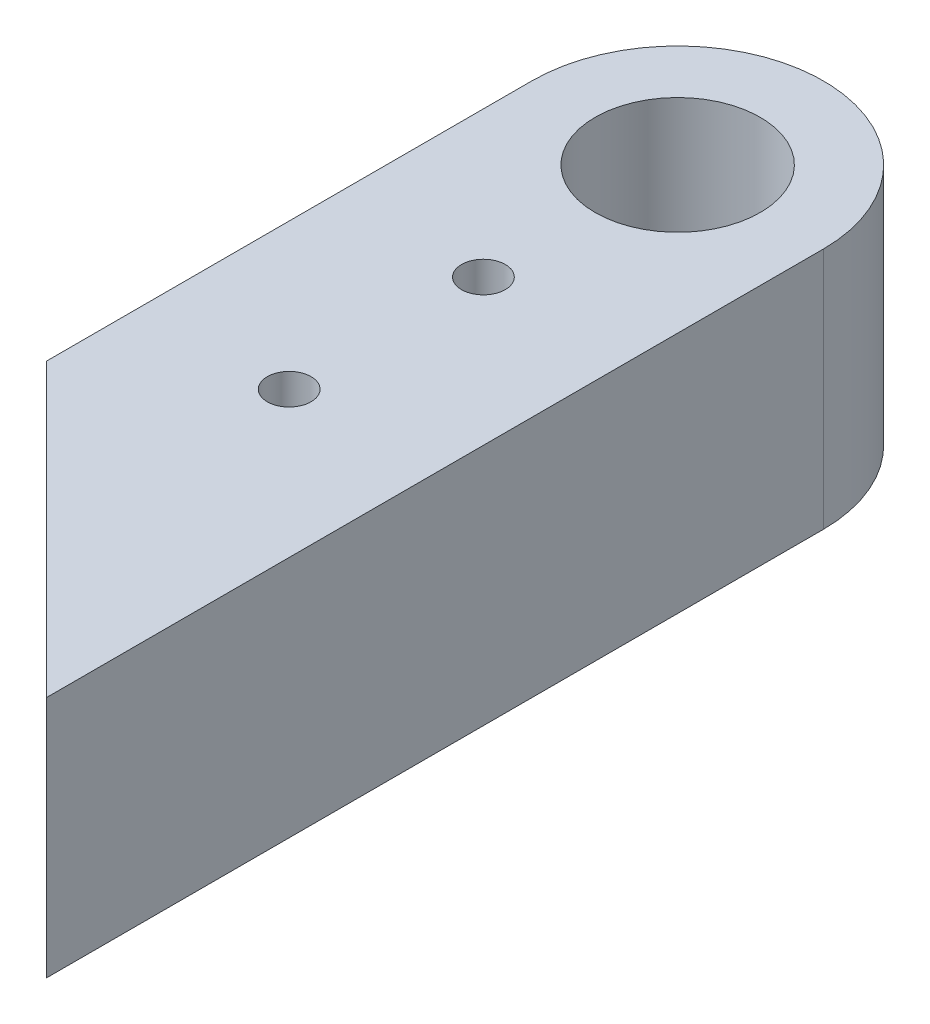
ISO-10303-21;
HEADER;
FILE_DESCRIPTION(('STEP AP214'),'2;1');
FILE_NAME('part.step','',(''),(''),'','','');
FILE_SCHEMA(('AUTOMOTIVE_DESIGN { 1 0 10303 214 1 1 1 1 }'));
ENDSEC;
DATA;
#1=APPLICATION_CONTEXT('core data for automotive mechanical design processes');
#2=APPLICATION_PROTOCOL_DEFINITION('international standard','automotive_design',2000,#1);
#3=PRODUCT_CONTEXT('',#1,'mechanical');
#4=PRODUCT('Part','Part','',(#3));
#5=PRODUCT_RELATED_PRODUCT_CATEGORY('part','',(#4));
#6=PRODUCT_DEFINITION_FORMATION('','',#4);
#7=PRODUCT_DEFINITION_CONTEXT('part definition',#1,'design');
#8=PRODUCT_DEFINITION('design','',#6,#7);
#9=PRODUCT_DEFINITION_SHAPE('','',#8);
#10=(LENGTH_UNIT() NAMED_UNIT(*) SI_UNIT(.MILLI.,.METRE.));
#11=(NAMED_UNIT(*) PLANE_ANGLE_UNIT() SI_UNIT($,.RADIAN.));
#12=(NAMED_UNIT(*) SI_UNIT($,.STERADIAN.) SOLID_ANGLE_UNIT());
#13=UNCERTAINTY_MEASURE_WITH_UNIT(LENGTH_MEASURE(1.E-05),#10,'distance_accuracy_value','');
#14=(GEOMETRIC_REPRESENTATION_CONTEXT(3) GLOBAL_UNCERTAINTY_ASSIGNED_CONTEXT((#13)) GLOBAL_UNIT_ASSIGNED_CONTEXT((#10,
#11,#12)) REPRESENTATION_CONTEXT('',''));
#15=CARTESIAN_POINT('',(0.,0.,0.));
#16=DIRECTION('',(0.,0.,1.));
#17=DIRECTION('',(1.,0.,0.));
#18=AXIS2_PLACEMENT_3D('',#15,#16,#17);
#19=CARTESIAN_POINT('',(0.,25.,0.));
#20=DIRECTION('',(0.,1.,0.));
#21=DIRECTION('',(0.,0.,1.));
#22=AXIS2_PLACEMENT_3D('',#19,#20,#21);
#23=PLANE('',#22);
#24=CARTESIAN_POINT('',(0.,25.,20.));
#25=DIRECTION('',(0.,1.,0.));
#26=DIRECTION('',(0.,0.,1.));
#27=AXIS2_PLACEMENT_3D('',#24,#25,#26);
#28=CIRCLE('',#27,2.25);
#29=CARTESIAN_POINT('',(0.,25.,22.25));
#30=VERTEX_POINT('',#29);
#31=EDGE_CURVE('E112',#30,#30,#28,.T.);
#32=ORIENTED_EDGE('',*,*,#31,.F.);
#33=EDGE_LOOP('',(#32));
#34=FACE_BOUND('',#33,.T.);
#35=CARTESIAN_POINT('',(0.,25.,0.));
#36=DIRECTION('',(0.,1.,0.));
#37=DIRECTION('',(0.,0.,1.));
#38=AXIS2_PLACEMENT_3D('',#35,#36,#37);
#39=CIRCLE('',#38,15.);
#40=CARTESIAN_POINT('',(15.,25.,0.));
#41=VERTEX_POINT('',#40);
#42=CARTESIAN_POINT('',(-15.,25.,0.));
#43=VERTEX_POINT('',#42);
#44=EDGE_CURVE('E83',#41,#43,#39,.T.);
#45=ORIENTED_EDGE('',*,*,#44,.T.);
#46=DIRECTION('',(0.,0.,1.));
#47=VECTOR('',#46,1.);
#48=CARTESIAN_POINT('',(-15.,25.,0.));
#49=LINE('',#48,#47);
#50=CARTESIAN_POINT('',(-15.,25.,50.));
#51=VERTEX_POINT('',#50);
#52=EDGE_CURVE('E77',#43,#51,#49,.T.);
#53=ORIENTED_EDGE('',*,*,#52,.T.);
#54=DIRECTION('',(0.707106781186556,0.,0.707106781186539));
#55=VECTOR('',#54,1.);
#56=CARTESIAN_POINT('',(-15.,25.,50.));
#57=LINE('',#56,#55);
#58=CARTESIAN_POINT('',(15.,25.,79.9999999999993));
#59=VERTEX_POINT('',#58);
#60=EDGE_CURVE('E80',#51,#59,#57,.T.);
#61=ORIENTED_EDGE('',*,*,#60,.T.);
#62=DIRECTION('',(0.,0.,-1.));
#63=VECTOR('',#62,1.);
#64=CARTESIAN_POINT('',(15.,25.,79.9999999999993));
#65=LINE('',#64,#63);
#66=EDGE_CURVE('E49',#59,#41,#65,.T.);
#67=ORIENTED_EDGE('',*,*,#66,.T.);
#68=EDGE_LOOP('',(#45,#53,#61,#67));
#69=FACE_BOUND('',#68,.T.);
#70=CARTESIAN_POINT('',(0.,25.,0.));
#71=DIRECTION('',(0.,1.,0.));
#72=DIRECTION('',(0.,0.,1.));
#73=AXIS2_PLACEMENT_3D('',#70,#71,#72);
#74=CIRCLE('',#73,8.5);
#75=CARTESIAN_POINT('',(0.,25.,8.5));
#76=VERTEX_POINT('',#75);
#77=EDGE_CURVE('E100',#76,#76,#74,.T.);
#78=ORIENTED_EDGE('',*,*,#77,.F.);
#79=EDGE_LOOP('',(#78));
#80=FACE_BOUND('',#79,.T.);
#81=CARTESIAN_POINT('',(0.,25.,40.));
#82=DIRECTION('',(0.,1.,0.));
#83=DIRECTION('',(0.,0.,1.));
#84=AXIS2_PLACEMENT_3D('',#81,#82,#83);
#85=CIRCLE('',#84,2.25);
#86=CARTESIAN_POINT('',(0.,25.,42.25));
#87=VERTEX_POINT('',#86);
#88=EDGE_CURVE('E118',#87,#87,#85,.T.);
#89=ORIENTED_EDGE('',*,*,#88,.F.);
#90=EDGE_LOOP('',(#89));
#91=FACE_BOUND('',#90,.T.);
#92=ADVANCED_FACE('F32',(#34,#69,#80,#91),#23,.T.);
#93=CARTESIAN_POINT('',(0.,0.,0.));
#94=DIRECTION('',(0.,1.,0.));
#95=DIRECTION('',(0.,0.,1.));
#96=AXIS2_PLACEMENT_3D('',#93,#94,#95);
#97=PLANE('',#96);
#98=CARTESIAN_POINT('',(0.,0.,0.));
#99=DIRECTION('',(0.,1.,0.));
#100=DIRECTION('',(0.,0.,1.));
#101=AXIS2_PLACEMENT_3D('',#98,#99,#100);
#102=CIRCLE('',#101,15.);
#103=CARTESIAN_POINT('',(15.,0.,0.));
#104=VERTEX_POINT('',#103);
#105=CARTESIAN_POINT('',(-15.,0.,0.));
#106=VERTEX_POINT('',#105);
#107=EDGE_CURVE('E97',#104,#106,#102,.T.);
#108=ORIENTED_EDGE('',*,*,#107,.F.);
#109=DIRECTION('',(0.,0.,-1.));
#110=VECTOR('',#109,1.);
#111=CARTESIAN_POINT('',(15.,0.,50.));
#112=LINE('',#111,#110);
#113=CARTESIAN_POINT('',(15.,0.,79.9999999999993));
#114=VERTEX_POINT('',#113);
#115=EDGE_CURVE('E66',#114,#104,#112,.T.);
#116=ORIENTED_EDGE('',*,*,#115,.F.);
#117=DIRECTION('',(0.707106781186556,0.,0.707106781186539));
#118=VECTOR('',#117,1.);
#119=CARTESIAN_POINT('',(-15.,0.,50.));
#120=LINE('',#119,#118);
#121=CARTESIAN_POINT('',(-15.,0.,50.));
#122=VERTEX_POINT('',#121);
#123=EDGE_CURVE('E102',#122,#114,#120,.T.);
#124=ORIENTED_EDGE('',*,*,#123,.F.);
#125=DIRECTION('',(0.,0.,1.));
#126=VECTOR('',#125,1.);
#127=CARTESIAN_POINT('',(-15.,0.,0.));
#128=LINE('',#127,#126);
#129=EDGE_CURVE('E88',#106,#122,#128,.T.);
#130=ORIENTED_EDGE('',*,*,#129,.F.);
#131=EDGE_LOOP('',(#108,#116,#124,#130));
#132=FACE_BOUND('',#131,.T.);
#133=CARTESIAN_POINT('',(0.,0.,0.));
#134=DIRECTION('',(0.,1.,0.));
#135=DIRECTION('',(0.,0.,1.));
#136=AXIS2_PLACEMENT_3D('',#133,#134,#135);
#137=CIRCLE('',#136,8.5);
#138=CARTESIAN_POINT('',(0.,0.,8.5));
#139=VERTEX_POINT('',#138);
#140=EDGE_CURVE('E109',#139,#139,#137,.T.);
#141=ORIENTED_EDGE('',*,*,#140,.T.);
#142=EDGE_LOOP('',(#141));
#143=FACE_BOUND('',#142,.T.);
#144=CARTESIAN_POINT('',(0.,0.,20.));
#145=DIRECTION('',(0.,1.,0.));
#146=DIRECTION('',(0.,0.,1.));
#147=AXIS2_PLACEMENT_3D('',#144,#145,#146);
#148=CIRCLE('',#147,2.25);
#149=CARTESIAN_POINT('',(0.,0.,22.25));
#150=VERTEX_POINT('',#149);
#151=EDGE_CURVE('E115',#150,#150,#148,.T.);
#152=ORIENTED_EDGE('',*,*,#151,.T.);
#153=EDGE_LOOP('',(#152));
#154=FACE_BOUND('',#153,.T.);
#155=CARTESIAN_POINT('',(0.,0.,40.));
#156=DIRECTION('',(0.,1.,0.));
#157=DIRECTION('',(0.,0.,1.));
#158=AXIS2_PLACEMENT_3D('',#155,#156,#157);
#159=CIRCLE('',#158,2.25);
#160=CARTESIAN_POINT('',(0.,0.,42.25));
#161=VERTEX_POINT('',#160);
#162=EDGE_CURVE('E121',#161,#161,#159,.T.);
#163=ORIENTED_EDGE('',*,*,#162,.T.);
#164=EDGE_LOOP('',(#163));
#165=FACE_BOUND('',#164,.T.);
#166=ADVANCED_FACE('F131',(#132,#143,#154,#165),#97,.F.);
#167=CARTESIAN_POINT('',(0.,25.,0.));
#168=DIRECTION('',(0.,-1.,0.));
#169=DIRECTION('',(0.,0.,-1.));
#170=AXIS2_PLACEMENT_3D('',#167,#168,#169);
#171=CYLINDRICAL_SURFACE('',#170,15.);
#172=ORIENTED_EDGE('',*,*,#107,.T.);
#173=DIRECTION('',(0.,-1.,0.));
#174=VECTOR('',#173,1.);
#175=CARTESIAN_POINT('',(-15.,25.,0.));
#176=LINE('',#175,#174);
#177=EDGE_CURVE('E11',#43,#106,#176,.T.);
#178=ORIENTED_EDGE('',*,*,#177,.F.);
#179=ORIENTED_EDGE('',*,*,#44,.F.);
#180=DIRECTION('',(0.,-1.,0.));
#181=VECTOR('',#180,1.);
#182=CARTESIAN_POINT('',(15.,25.,0.));
#183=LINE('',#182,#181);
#184=EDGE_CURVE('E93',#41,#104,#183,.T.);
#185=ORIENTED_EDGE('',*,*,#184,.T.);
#186=EDGE_LOOP('',(#172,#178,#179,#185));
#187=FACE_BOUND('',#186,.T.);
#188=ADVANCED_FACE('F34',(#187),#171,.T.);
#189=CARTESIAN_POINT('',(-15.,25.,0.));
#190=DIRECTION('',(1.,0.,0.));
#191=DIRECTION('',(0.,0.,-1.));
#192=AXIS2_PLACEMENT_3D('',#189,#190,#191);
#193=PLANE('',#192);
#194=ORIENTED_EDGE('',*,*,#129,.T.);
#195=DIRECTION('',(0.,-1.,0.));
#196=VECTOR('',#195,1.);
#197=CARTESIAN_POINT('',(-15.,25.,50.));
#198=LINE('',#197,#196);
#199=EDGE_CURVE('E41',#51,#122,#198,.T.);
#200=ORIENTED_EDGE('',*,*,#199,.F.);
#201=ORIENTED_EDGE('',*,*,#52,.F.);
#202=ORIENTED_EDGE('',*,*,#177,.T.);
#203=EDGE_LOOP('',(#194,#200,#201,#202));
#204=FACE_BOUND('',#203,.T.);
#205=ADVANCED_FACE('F87',(#204),#193,.F.);
#206=CARTESIAN_POINT('',(-15.,25.,50.));
#207=DIRECTION('',(0.707106781186539,0.,-0.707106781186556));
#208=DIRECTION('',(-0.707106781186556,0.,-0.707106781186539));
#209=AXIS2_PLACEMENT_3D('',#206,#207,#208);
#210=PLANE('',#209);
#211=ORIENTED_EDGE('',*,*,#123,.T.);
#212=DIRECTION('',(0.,-1.,0.));
#213=VECTOR('',#212,1.);
#214=CARTESIAN_POINT('',(15.,25.,79.9999999999993));
#215=LINE('',#214,#213);
#216=EDGE_CURVE('E90',#59,#114,#215,.T.);
#217=ORIENTED_EDGE('',*,*,#216,.F.);
#218=ORIENTED_EDGE('',*,*,#60,.F.);
#219=ORIENTED_EDGE('',*,*,#199,.T.);
#220=EDGE_LOOP('',(#211,#217,#218,#219));
#221=FACE_BOUND('',#220,.T.);
#222=ADVANCED_FACE('F91',(#221),#210,.F.);
#223=CARTESIAN_POINT('',(15.,25.,50.));
#224=DIRECTION('',(-1.,0.,0.));
#225=DIRECTION('',(0.,0.,1.));
#226=AXIS2_PLACEMENT_3D('',#223,#224,#225);
#227=PLANE('',#226);
#228=ORIENTED_EDGE('',*,*,#115,.T.);
#229=ORIENTED_EDGE('',*,*,#184,.F.);
#230=ORIENTED_EDGE('',*,*,#66,.F.);
#231=ORIENTED_EDGE('',*,*,#216,.T.);
#232=EDGE_LOOP('',(#228,#229,#230,#231));
#233=FACE_BOUND('',#232,.T.);
#234=ADVANCED_FACE('F106',(#233),#227,.F.);
#235=CARTESIAN_POINT('',(0.,25.,0.));
#236=DIRECTION('',(0.,-1.,0.));
#237=DIRECTION('',(0.,0.,-1.));
#238=AXIS2_PLACEMENT_3D('',#235,#236,#237);
#239=CYLINDRICAL_SURFACE('',#238,8.5);
#240=ORIENTED_EDGE('',*,*,#77,.T.);
#241=EDGE_LOOP('',(#240));
#242=FACE_BOUND('',#241,.T.);
#243=ORIENTED_EDGE('',*,*,#140,.F.);
#244=EDGE_LOOP('',(#243));
#245=FACE_BOUND('',#244,.T.);
#246=ADVANCED_FACE('F140',(#242,#245),#239,.F.);
#247=CARTESIAN_POINT('',(0.,25.,20.));
#248=DIRECTION('',(0.,-1.,0.));
#249=DIRECTION('',(0.,0.,-1.));
#250=AXIS2_PLACEMENT_3D('',#247,#248,#249);
#251=CYLINDRICAL_SURFACE('',#250,2.25);
#252=ORIENTED_EDGE('',*,*,#31,.T.);
#253=EDGE_LOOP('',(#252));
#254=FACE_BOUND('',#253,.T.);
#255=ORIENTED_EDGE('',*,*,#151,.F.);
#256=EDGE_LOOP('',(#255));
#257=FACE_BOUND('',#256,.T.);
#258=ADVANCED_FACE('F189',(#254,#257),#251,.F.);
#259=CARTESIAN_POINT('',(0.,25.,40.));
#260=DIRECTION('',(0.,-1.,0.));
#261=DIRECTION('',(0.,0.,-1.));
#262=AXIS2_PLACEMENT_3D('',#259,#260,#261);
#263=CYLINDRICAL_SURFACE('',#262,2.25);
#264=ORIENTED_EDGE('',*,*,#88,.T.);
#265=EDGE_LOOP('',(#264));
#266=FACE_BOUND('',#265,.T.);
#267=ORIENTED_EDGE('',*,*,#162,.F.);
#268=EDGE_LOOP('',(#267));
#269=FACE_BOUND('',#268,.T.);
#270=ADVANCED_FACE('F127',(#266,#269),#263,.F.);
#271=CLOSED_SHELL('',(#92,#166,#188,#205,#222,#234,#246,#258,#270));
#272=MANIFOLD_SOLID_BREP('B2',#271);
#273=ADVANCED_BREP_SHAPE_REPRESENTATION('',(#18,#272),#14);
#274=SHAPE_DEFINITION_REPRESENTATION(#9,#273);
ENDSEC;
END-ISO-10303-21;
